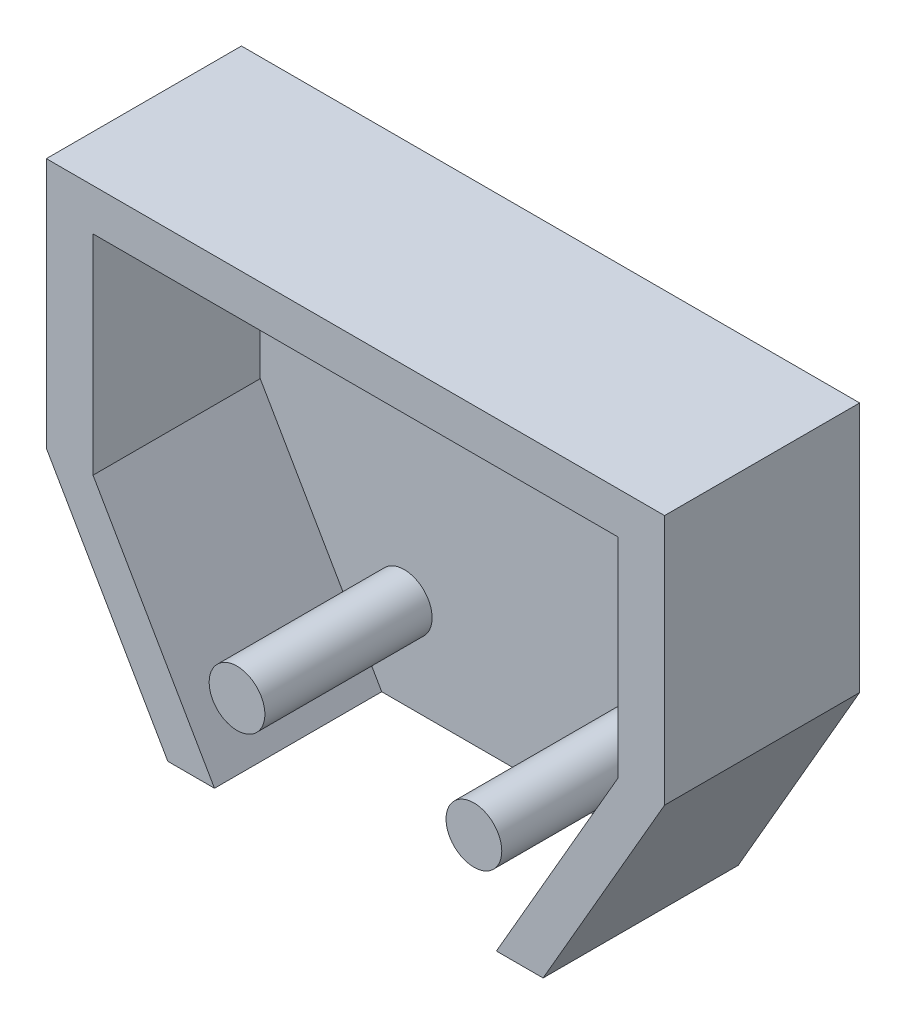
ISO-10303-21;
HEADER;
FILE_DESCRIPTION(('STEP AP214'),'2;1');
FILE_NAME('part.step','',(''),(''),'','','');
FILE_SCHEMA(('AUTOMOTIVE_DESIGN { 1 0 10303 214 1 1 1 1 }'));
ENDSEC;
DATA;
#1=APPLICATION_CONTEXT('core data for automotive mechanical design processes');
#2=APPLICATION_PROTOCOL_DEFINITION('international standard','automotive_design',2000,#1);
#3=PRODUCT_CONTEXT('',#1,'mechanical');
#4=PRODUCT('Part','Part','',(#3));
#5=PRODUCT_RELATED_PRODUCT_CATEGORY('part','',(#4));
#6=PRODUCT_DEFINITION_FORMATION('','',#4);
#7=PRODUCT_DEFINITION_CONTEXT('part definition',#1,'design');
#8=PRODUCT_DEFINITION('design','',#6,#7);
#9=PRODUCT_DEFINITION_SHAPE('','',#8);
#10=(LENGTH_UNIT() NAMED_UNIT(*) SI_UNIT(.MILLI.,.METRE.));
#11=(NAMED_UNIT(*) PLANE_ANGLE_UNIT() SI_UNIT($,.RADIAN.));
#12=(NAMED_UNIT(*) SI_UNIT($,.STERADIAN.) SOLID_ANGLE_UNIT());
#13=UNCERTAINTY_MEASURE_WITH_UNIT(LENGTH_MEASURE(1.E-05),#10,'distance_accuracy_value','');
#14=(GEOMETRIC_REPRESENTATION_CONTEXT(3) GLOBAL_UNCERTAINTY_ASSIGNED_CONTEXT((#13)) GLOBAL_UNIT_ASSIGNED_CONTEXT((#10,
#11,#12)) REPRESENTATION_CONTEXT('',''));
#15=CARTESIAN_POINT('',(0.,0.,0.));
#16=DIRECTION('',(0.,0.,1.));
#17=DIRECTION('',(1.,0.,0.));
#18=AXIS2_PLACEMENT_3D('',#15,#16,#17);
#19=CARTESIAN_POINT('',(0.,0.,2.));
#20=DIRECTION('',(0.,0.,-1.));
#21=DIRECTION('',(-1.,0.,0.));
#22=AXIS2_PLACEMENT_3D('',#19,#20,#21);
#23=PLANE('',#22);
#24=CARTESIAN_POINT('',(32.355,-11.594084101994,2.));
#25=DIRECTION('',(0.,0.,1.));
#26=DIRECTION('',(1.,0.,0.));
#27=AXIS2_PLACEMENT_3D('',#24,#25,#26);
#28=CIRCLE('',#27,2.00000000000001);
#29=CARTESIAN_POINT('',(34.355,-11.594084101994,2.));
#30=VERTEX_POINT('',#29);
#31=EDGE_CURVE('E264',#30,#30,#28,.F.);
#32=ORIENTED_EDGE('',*,*,#31,.T.);
#33=EDGE_LOOP('',(#32));
#34=FACE_BOUND('',#33,.T.);
#35=CARTESIAN_POINT('',(15.355,-11.594084101994,2.));
#36=DIRECTION('',(0.,0.,-1.));
#37=DIRECTION('',(-1.,0.,0.));
#38=AXIS2_PLACEMENT_3D('',#35,#36,#37);
#39=CIRCLE('',#38,2.);
#40=CARTESIAN_POINT('',(13.355,-11.594084101994,2.));
#41=VERTEX_POINT('',#40);
#42=EDGE_CURVE('E11',#41,#41,#39,.F.);
#43=ORIENTED_EDGE('',*,*,#42,.F.);
#44=EDGE_LOOP('',(#43));
#45=FACE_BOUND('',#44,.T.);
#46=DIRECTION('',(-0.499999999999998,-0.86602540378444,0.));
#47=VECTOR('',#46,1.);
#48=CARTESIAN_POINT('',(33.2703525403786,-19.2086469952212,2.));
#49=LINE('',#48,#47);
#50=CARTESIAN_POINT('',(42.6884591186013,-2.89600789064071,1.99999999999999));
#51=VERTEX_POINT('',#50);
#52=CARTESIAN_POINT('',(33.970470053838,-17.9960078906407,2.));
#53=VERTEX_POINT('',#52);
#54=EDGE_CURVE('E276',#51,#53,#49,.T.);
#55=ORIENTED_EDGE('',*,*,#54,.F.);
#56=DIRECTION('',(0.,-1.,0.));
#57=VECTOR('',#56,1.);
#58=CARTESIAN_POINT('',(42.6884591186013,12.1039921093593,1.99999999999999));
#59=LINE('',#58,#57);
#60=CARTESIAN_POINT('',(42.6884591186013,12.1039921093593,1.99999999999999));
#61=VERTEX_POINT('',#60);
#62=EDGE_CURVE('E258',#61,#51,#59,.T.);
#63=ORIENTED_EDGE('',*,*,#62,.F.);
#64=DIRECTION('',(1.,0.,0.));
#65=VECTOR('',#64,1.);
#66=CARTESIAN_POINT('',(42.6884591186013,12.1039921093593,1.99999999999999));
#67=LINE('',#66,#65);
#68=CARTESIAN_POINT('',(5.02154088139889,12.1039921093593,2.));
#69=VERTEX_POINT('',#68);
#70=EDGE_CURVE('E230',#69,#61,#67,.T.);
#71=ORIENTED_EDGE('',*,*,#70,.F.);
#72=DIRECTION('',(0.,-1.,0.));
#73=VECTOR('',#72,1.);
#74=CARTESIAN_POINT('',(5.02154088139889,12.1039921093593,2.));
#75=LINE('',#74,#73);
#76=CARTESIAN_POINT('',(5.0215408813989,-2.89600789064073,2.));
#77=VERTEX_POINT('',#76);
#78=EDGE_CURVE('E261',#69,#77,#75,.T.);
#79=ORIENTED_EDGE('',*,*,#78,.T.);
#80=DIRECTION('',(-0.499999999999998,0.86602540378444,0.));
#81=VECTOR('',#80,1.);
#82=CARTESIAN_POINT('',(2.51214745962165,1.45038901205659,2.));
#83=LINE('',#82,#81);
#84=CARTESIAN_POINT('',(13.7395299461622,-17.9960078906407,2.));
#85=VERTEX_POINT('',#84);
#86=EDGE_CURVE('E301',#85,#77,#83,.T.);
#87=ORIENTED_EDGE('',*,*,#86,.F.);
#88=DIRECTION('',(1.,0.,0.));
#89=VECTOR('',#88,1.);
#90=CARTESIAN_POINT('',(37.3200000000002,-17.9960078906407,2.));
#91=LINE('',#90,#89);
#92=EDGE_CURVE('E65',#85,#53,#91,.T.);
#93=ORIENTED_EDGE('',*,*,#92,.T.);
#94=EDGE_LOOP('',(#55,#63,#71,#79,#87,#93));
#95=FACE_BOUND('',#94,.T.);
#96=ADVANCED_FACE('F41',(#34,#45,#95),#23,.F.);
#97=CARTESIAN_POINT('',(10.3899999999998,-17.9960078906407,2.));
#98=DIRECTION('',(0.866025403784443,0.499999999999992,0.));
#99=DIRECTION('',(-0.499999999999992,0.866025403784443,0.));
#100=AXIS2_PLACEMENT_3D('',#97,#98,#99);
#101=PLANE('',#100);
#102=DIRECTION('',(0.,0.,-1.));
#103=VECTOR('',#102,1.);
#104=CARTESIAN_POINT('',(1.67201093523667,-2.89600789064074,14.));
#105=LINE('',#104,#103);
#106=CARTESIAN_POINT('',(1.67201093523667,-2.89600789064074,14.));
#107=VERTEX_POINT('',#106);
#108=CARTESIAN_POINT('',(1.67201093523667,-2.89600789064074,0.));
#109=VERTEX_POINT('',#108);
#110=EDGE_CURVE('E320',#107,#109,#105,.T.);
#111=ORIENTED_EDGE('',*,*,#110,.T.);
#112=DIRECTION('',(0.499999999999992,-0.866025403784443,0.));
#113=VECTOR('',#112,1.);
#114=CARTESIAN_POINT('',(10.3899999999998,-17.9960078906407,0.));
#115=LINE('',#114,#113);
#116=CARTESIAN_POINT('',(10.3899999999998,-17.9960078906407,0.));
#117=VERTEX_POINT('',#116);
#118=EDGE_CURVE('E328',#109,#117,#115,.T.);
#119=ORIENTED_EDGE('',*,*,#118,.T.);
#120=DIRECTION('',(0.,0.,-1.));
#121=VECTOR('',#120,1.);
#122=CARTESIAN_POINT('',(10.3899999999998,-17.9960078906407,2.));
#123=LINE('',#122,#121);
#124=CARTESIAN_POINT('',(10.3899999999998,-17.9960078906407,14.));
#125=VERTEX_POINT('',#124);
#126=EDGE_CURVE('E50',#125,#117,#123,.T.);
#127=ORIENTED_EDGE('',*,*,#126,.F.);
#128=DIRECTION('',(0.499999999999992,-0.866025403784443,0.));
#129=VECTOR('',#128,1.);
#130=CARTESIAN_POINT('',(0.,0.,14.));
#131=LINE('',#130,#129);
#132=EDGE_CURVE('E306',#107,#125,#131,.T.);
#133=ORIENTED_EDGE('',*,*,#132,.F.);
#134=EDGE_LOOP('',(#111,#119,#127,#133));
#135=FACE_BOUND('',#134,.T.);
#136=ADVANCED_FACE('F43',(#135),#101,.F.);
#137=CARTESIAN_POINT('',(37.3200000000002,-17.9960078906407,2.));
#138=DIRECTION('',(0.,1.,0.));
#139=DIRECTION('',(-1.,0.,0.));
#140=AXIS2_PLACEMENT_3D('',#137,#138,#139);
#141=PLANE('',#140);
#142=DIRECTION('',(1.,0.,0.));
#143=VECTOR('',#142,1.);
#144=CARTESIAN_POINT('',(37.3200000000002,-17.9960078906407,0.));
#145=LINE('',#144,#143);
#146=CARTESIAN_POINT('',(37.3200000000002,-17.9960078906407,0.));
#147=VERTEX_POINT('',#146);
#148=EDGE_CURVE('E335',#117,#147,#145,.T.);
#149=ORIENTED_EDGE('',*,*,#148,.T.);
#150=DIRECTION('',(0.,0.,-1.));
#151=VECTOR('',#150,1.);
#152=CARTESIAN_POINT('',(37.3200000000002,-17.9960078906407,2.));
#153=LINE('',#152,#151);
#154=CARTESIAN_POINT('',(37.3200000000002,-17.9960078906407,14.));
#155=VERTEX_POINT('',#154);
#156=EDGE_CURVE('E331',#155,#147,#153,.T.);
#157=ORIENTED_EDGE('',*,*,#156,.F.);
#158=DIRECTION('',(1.,0.,0.));
#159=VECTOR('',#158,1.);
#160=CARTESIAN_POINT('',(0.,-17.9960078906407,14.));
#161=LINE('',#160,#159);
#162=CARTESIAN_POINT('',(33.970470053838,-17.9960078906407,14.));
#163=VERTEX_POINT('',#162);
#164=EDGE_CURVE('E280',#163,#155,#161,.T.);
#165=ORIENTED_EDGE('',*,*,#164,.F.);
#166=DIRECTION('',(0.,0.,-1.));
#167=VECTOR('',#166,1.);
#168=CARTESIAN_POINT('',(33.970470053838,-17.9960078906407,14.));
#169=LINE('',#168,#167);
#170=EDGE_CURVE('E293',#163,#53,#169,.T.);
#171=ORIENTED_EDGE('',*,*,#170,.T.);
#172=ORIENTED_EDGE('',*,*,#92,.F.);
#173=DIRECTION('',(0.,0.,-1.));
#174=VECTOR('',#173,1.);
#175=CARTESIAN_POINT('',(13.7395299461622,-17.9960078906407,14.));
#176=LINE('',#175,#174);
#177=CARTESIAN_POINT('',(13.7395299461622,-17.9960078906407,14.));
#178=VERTEX_POINT('',#177);
#179=EDGE_CURVE('E313',#178,#85,#176,.T.);
#180=ORIENTED_EDGE('',*,*,#179,.F.);
#181=DIRECTION('',(1.,0.,0.));
#182=VECTOR('',#181,1.);
#183=CARTESIAN_POINT('',(0.,-17.9960078906407,14.));
#184=LINE('',#183,#182);
#185=EDGE_CURVE('E310',#125,#178,#184,.T.);
#186=ORIENTED_EDGE('',*,*,#185,.F.);
#187=ORIENTED_EDGE('',*,*,#126,.T.);
#188=EDGE_LOOP('',(#149,#157,#165,#171,#172,#180,#186,#187));
#189=FACE_BOUND('',#188,.T.);
#190=ADVANCED_FACE('F347',(#189),#141,.F.);
#191=CARTESIAN_POINT('',(47.71,0.,2.));
#192=DIRECTION('',(-0.866025403784443,0.499999999999992,0.));
#193=DIRECTION('',(-0.499999999999992,-0.866025403784443,0.));
#194=AXIS2_PLACEMENT_3D('',#191,#192,#193);
#195=PLANE('',#194);
#196=DIRECTION('',(0.499999999999992,0.866025403784443,0.));
#197=VECTOR('',#196,1.);
#198=CARTESIAN_POINT('',(47.71,0.,0.));
#199=LINE('',#198,#197);
#200=CARTESIAN_POINT('',(46.0379890647633,-2.89600789064071,0.));
#201=VERTEX_POINT('',#200);
#202=EDGE_CURVE('E332',#147,#201,#199,.T.);
#203=ORIENTED_EDGE('',*,*,#202,.T.);
#204=DIRECTION('',(0.,0.,-1.));
#205=VECTOR('',#204,1.);
#206=CARTESIAN_POINT('',(46.0379890647633,-2.89600789064074,14.));
#207=LINE('',#206,#205);
#208=CARTESIAN_POINT('',(46.0379890647633,-2.89600789064071,14.));
#209=VERTEX_POINT('',#208);
#210=EDGE_CURVE('E288',#209,#201,#207,.T.);
#211=ORIENTED_EDGE('',*,*,#210,.F.);
#212=DIRECTION('',(0.499999999999992,0.866025403784443,0.));
#213=VECTOR('',#212,1.);
#214=CARTESIAN_POINT('',(35.7825000000004,-20.6590360072776,14.));
#215=LINE('',#214,#213);
#216=EDGE_CURVE('E284',#155,#209,#215,.T.);
#217=ORIENTED_EDGE('',*,*,#216,.F.);
#218=ORIENTED_EDGE('',*,*,#156,.T.);
#219=EDGE_LOOP('',(#203,#211,#217,#218));
#220=FACE_BOUND('',#219,.T.);
#221=ADVANCED_FACE('F366',(#220),#195,.F.);
#222=CARTESIAN_POINT('',(0.,0.,0.));
#223=DIRECTION('',(0.,0.,-1.));
#224=DIRECTION('',(-1.,0.,0.));
#225=AXIS2_PLACEMENT_3D('',#222,#223,#224);
#226=PLANE('',#225);
#227=ORIENTED_EDGE('',*,*,#118,.F.);
#228=DIRECTION('',(0.,-1.,0.));
#229=VECTOR('',#228,1.);
#230=CARTESIAN_POINT('',(1.67201093523666,12.1039921093593,0.));
#231=LINE('',#230,#229);
#232=CARTESIAN_POINT('',(1.67201093523666,15.1039921093593,0.));
#233=VERTEX_POINT('',#232);
#234=EDGE_CURVE('E244',#233,#109,#231,.T.);
#235=ORIENTED_EDGE('',*,*,#234,.F.);
#236=DIRECTION('',(-1.,0.,0.));
#237=VECTOR('',#236,1.);
#238=CARTESIAN_POINT('',(1.67201093523666,15.1039921093593,0.));
#239=LINE('',#238,#237);
#240=CARTESIAN_POINT('',(46.0379890647633,15.1039921093593,0.));
#241=VERTEX_POINT('',#240);
#242=EDGE_CURVE('E219',#241,#233,#239,.T.);
#243=ORIENTED_EDGE('',*,*,#242,.F.);
#244=DIRECTION('',(0.,-1.,0.));
#245=VECTOR('',#244,1.);
#246=CARTESIAN_POINT('',(46.0379890647633,12.1039921093593,0.));
#247=LINE('',#246,#245);
#248=EDGE_CURVE('E247',#241,#201,#247,.T.);
#249=ORIENTED_EDGE('',*,*,#248,.T.);
#250=ORIENTED_EDGE('',*,*,#202,.F.);
#251=ORIENTED_EDGE('',*,*,#148,.F.);
#252=EDGE_LOOP('',(#227,#235,#243,#249,#250,#251));
#253=FACE_BOUND('',#252,.T.);
#254=ADVANCED_FACE('F361',(#253),#226,.T.);
#255=CARTESIAN_POINT('',(2.51214745962165,1.45038901205659,14.));
#256=DIRECTION('',(-0.86602540378444,-0.499999999999998,0.));
#257=DIRECTION('',(0.499999999999998,-0.86602540378444,0.));
#258=AXIS2_PLACEMENT_3D('',#255,#256,#257);
#259=PLANE('',#258);
#260=ORIENTED_EDGE('',*,*,#86,.T.);
#261=DIRECTION('',(0.,0.,-1.));
#262=VECTOR('',#261,1.);
#263=CARTESIAN_POINT('',(5.02154088139889,-2.89600789064074,14.));
#264=LINE('',#263,#262);
#265=CARTESIAN_POINT('',(5.02154088139889,-2.89600789064073,14.));
#266=VERTEX_POINT('',#265);
#267=EDGE_CURVE('E324',#266,#77,#264,.T.);
#268=ORIENTED_EDGE('',*,*,#267,.F.);
#269=DIRECTION('',(-0.499999999999998,0.86602540378444,0.));
#270=VECTOR('',#269,1.);
#271=CARTESIAN_POINT('',(2.51214745962165,1.45038901205659,14.));
#272=LINE('',#271,#270);
#273=EDGE_CURVE('E302',#178,#266,#272,.T.);
#274=ORIENTED_EDGE('',*,*,#273,.F.);
#275=ORIENTED_EDGE('',*,*,#179,.T.);
#276=EDGE_LOOP('',(#260,#268,#274,#275));
#277=FACE_BOUND('',#276,.T.);
#278=ADVANCED_FACE('F375',(#277),#259,.F.);
#279=CARTESIAN_POINT('',(0.,0.,14.));
#280=DIRECTION('',(0.,0.,1.));
#281=DIRECTION('',(1.,0.,0.));
#282=AXIS2_PLACEMENT_3D('',#279,#280,#281);
#283=PLANE('',#282);
#284=ORIENTED_EDGE('',*,*,#273,.T.);
#285=DIRECTION('',(0.,-1.,0.));
#286=VECTOR('',#285,1.);
#287=CARTESIAN_POINT('',(5.02154088139888,12.1039921093593,14.));
#288=LINE('',#287,#286);
#289=CARTESIAN_POINT('',(5.02154088139888,12.1039921093593,14.));
#290=VERTEX_POINT('',#289);
#291=EDGE_CURVE('E238',#290,#266,#288,.T.);
#292=ORIENTED_EDGE('',*,*,#291,.F.);
#293=DIRECTION('',(1.,0.,0.));
#294=VECTOR('',#293,1.);
#295=CARTESIAN_POINT('',(1.67201093523666,12.1039921093593,14.));
#296=LINE('',#295,#294);
#297=CARTESIAN_POINT('',(42.6884591186013,12.1039921093593,14.));
#298=VERTEX_POINT('',#297);
#299=EDGE_CURVE('E201',#290,#298,#296,.T.);
#300=ORIENTED_EDGE('',*,*,#299,.T.);
#301=DIRECTION('',(0.,-1.,0.));
#302=VECTOR('',#301,1.);
#303=CARTESIAN_POINT('',(42.6884591186013,12.1039921093593,14.));
#304=LINE('',#303,#302);
#305=CARTESIAN_POINT('',(42.6884591186013,-2.89600789064071,14.));
#306=VERTEX_POINT('',#305);
#307=EDGE_CURVE('E254',#298,#306,#304,.T.);
#308=ORIENTED_EDGE('',*,*,#307,.T.);
#309=DIRECTION('',(-0.499999999999998,-0.86602540378444,0.));
#310=VECTOR('',#309,1.);
#311=CARTESIAN_POINT('',(33.2703525403786,-19.2086469952212,14.));
#312=LINE('',#311,#310);
#313=EDGE_CURVE('E277',#306,#163,#312,.T.);
#314=ORIENTED_EDGE('',*,*,#313,.T.);
#315=ORIENTED_EDGE('',*,*,#164,.T.);
#316=ORIENTED_EDGE('',*,*,#216,.T.);
#317=DIRECTION('',(0.,-1.,0.));
#318=VECTOR('',#317,1.);
#319=CARTESIAN_POINT('',(46.0379890647633,12.1039921093593,14.));
#320=LINE('',#319,#318);
#321=CARTESIAN_POINT('',(46.0379890647633,15.1039921093593,14.));
#322=VERTEX_POINT('',#321);
#323=EDGE_CURVE('E251',#322,#209,#320,.T.);
#324=ORIENTED_EDGE('',*,*,#323,.F.);
#325=DIRECTION('',(1.,0.,0.));
#326=VECTOR('',#325,1.);
#327=CARTESIAN_POINT('',(1.67201093523666,15.1039921093593,14.));
#328=LINE('',#327,#326);
#329=CARTESIAN_POINT('',(1.67201093523666,15.1039921093593,14.));
#330=VERTEX_POINT('',#329);
#331=EDGE_CURVE('E211',#330,#322,#328,.T.);
#332=ORIENTED_EDGE('',*,*,#331,.F.);
#333=DIRECTION('',(0.,-1.,0.));
#334=VECTOR('',#333,1.);
#335=CARTESIAN_POINT('',(1.67201093523666,12.1039921093593,14.));
#336=LINE('',#335,#334);
#337=EDGE_CURVE('E241',#330,#107,#336,.T.);
#338=ORIENTED_EDGE('',*,*,#337,.T.);
#339=ORIENTED_EDGE('',*,*,#132,.T.);
#340=ORIENTED_EDGE('',*,*,#185,.T.);
#341=EDGE_LOOP('',(#284,#292,#300,#308,#314,#315,#316,#324,#332,#338,#339,#340));
#342=FACE_BOUND('',#341,.T.);
#343=ADVANCED_FACE('F354',(#342),#283,.T.);
#344=CARTESIAN_POINT('',(33.2703525403786,-19.2086469952212,14.));
#345=DIRECTION('',(0.86602540378444,-0.499999999999998,0.));
#346=DIRECTION('',(0.499999999999998,0.86602540378444,0.));
#347=AXIS2_PLACEMENT_3D('',#344,#345,#346);
#348=PLANE('',#347);
#349=ORIENTED_EDGE('',*,*,#54,.T.);
#350=ORIENTED_EDGE('',*,*,#170,.F.);
#351=ORIENTED_EDGE('',*,*,#313,.F.);
#352=DIRECTION('',(0.,0.,-1.));
#353=VECTOR('',#352,1.);
#354=CARTESIAN_POINT('',(42.6884591186013,-2.89600789064074,14.));
#355=LINE('',#354,#353);
#356=EDGE_CURVE('E297',#306,#51,#355,.T.);
#357=ORIENTED_EDGE('',*,*,#356,.T.);
#358=EDGE_LOOP('',(#349,#350,#351,#357));
#359=FACE_BOUND('',#358,.T.);
#360=ADVANCED_FACE('F372',(#359),#348,.F.);
#361=CARTESIAN_POINT('',(15.355,-11.594084101994,14.));
#362=DIRECTION('',(0.,0.,-1.));
#363=DIRECTION('',(-1.,0.,0.));
#364=AXIS2_PLACEMENT_3D('',#361,#362,#363);
#365=CYLINDRICAL_SURFACE('',#364,2.);
#366=CARTESIAN_POINT('',(15.355,-11.594084101994,14.));
#367=DIRECTION('',(0.,0.,1.));
#368=DIRECTION('',(1.,0.,0.));
#369=AXIS2_PLACEMENT_3D('',#366,#367,#368);
#370=CIRCLE('',#369,2.);
#371=CARTESIAN_POINT('',(17.355,-11.594084101994,14.));
#372=VERTEX_POINT('',#371);
#373=EDGE_CURVE('E269',#372,#372,#370,.T.);
#374=ORIENTED_EDGE('',*,*,#373,.F.);
#375=EDGE_LOOP('',(#374));
#376=FACE_BOUND('',#375,.T.);
#377=ORIENTED_EDGE('',*,*,#42,.T.);
#378=EDGE_LOOP('',(#377));
#379=FACE_BOUND('',#378,.T.);
#380=ADVANCED_FACE('F431',(#376,#379),#365,.T.);
#381=CARTESIAN_POINT('',(0.,0.,14.));
#382=DIRECTION('',(0.,0.,1.));
#383=DIRECTION('',(1.,0.,0.));
#384=AXIS2_PLACEMENT_3D('',#381,#382,#383);
#385=PLANE('',#384);
#386=ORIENTED_EDGE('',*,*,#373,.T.);
#387=EDGE_LOOP('',(#386));
#388=FACE_BOUND('',#387,.T.);
#389=ADVANCED_FACE('F437',(#388),#385,.T.);
#390=CARTESIAN_POINT('',(32.355,-11.594084101994,14.));
#391=DIRECTION('',(0.,0.,-1.));
#392=DIRECTION('',(-1.,0.,0.));
#393=AXIS2_PLACEMENT_3D('',#390,#391,#392);
#394=CYLINDRICAL_SURFACE('',#393,2.00000000000001);
#395=CARTESIAN_POINT('',(32.355,-11.594084101994,14.));
#396=DIRECTION('',(0.,0.,1.));
#397=DIRECTION('',(1.,0.,0.));
#398=AXIS2_PLACEMENT_3D('',#395,#396,#397);
#399=CIRCLE('',#398,2.00000000000001);
#400=CARTESIAN_POINT('',(34.355,-11.594084101994,14.));
#401=VERTEX_POINT('',#400);
#402=EDGE_CURVE('E265',#401,#401,#399,.F.);
#403=ORIENTED_EDGE('',*,*,#402,.T.);
#404=EDGE_LOOP('',(#403));
#405=FACE_BOUND('',#404,.T.);
#406=ORIENTED_EDGE('',*,*,#31,.F.);
#407=EDGE_LOOP('',(#406));
#408=FACE_BOUND('',#407,.T.);
#409=ADVANCED_FACE('F445',(#405,#408),#394,.T.);
#410=CARTESIAN_POINT('',(0.,0.,14.));
#411=DIRECTION('',(0.,0.,1.));
#412=DIRECTION('',(1.,0.,0.));
#413=AXIS2_PLACEMENT_3D('',#410,#411,#412);
#414=PLANE('',#413);
#415=ORIENTED_EDGE('',*,*,#402,.F.);
#416=EDGE_LOOP('',(#415));
#417=FACE_BOUND('',#416,.T.);
#418=ADVANCED_FACE('F453',(#417),#414,.T.);
#419=CARTESIAN_POINT('',(5.02154088139889,12.1039921093593,2.));
#420=DIRECTION('',(-1.,0.,0.));
#421=DIRECTION('',(0.,-1.,0.));
#422=AXIS2_PLACEMENT_3D('',#419,#420,#421);
#423=PLANE('',#422);
#424=ORIENTED_EDGE('',*,*,#267,.T.);
#425=ORIENTED_EDGE('',*,*,#78,.F.);
#426=DIRECTION('',(0.,0.,-1.));
#427=VECTOR('',#426,1.);
#428=CARTESIAN_POINT('',(5.02154088139889,12.1039921093593,2.));
#429=LINE('',#428,#427);
#430=EDGE_CURVE('E223',#290,#69,#429,.T.);
#431=ORIENTED_EDGE('',*,*,#430,.F.);
#432=ORIENTED_EDGE('',*,*,#291,.T.);
#433=EDGE_LOOP('',(#424,#425,#431,#432));
#434=FACE_BOUND('',#433,.T.);
#435=ADVANCED_FACE('F381',(#434),#423,.F.);
#436=CARTESIAN_POINT('',(42.6884591186013,12.1039921093593,14.));
#437=DIRECTION('',(1.,0.,0.));
#438=DIRECTION('',(0.,1.,0.));
#439=AXIS2_PLACEMENT_3D('',#436,#437,#438);
#440=PLANE('',#439);
#441=ORIENTED_EDGE('',*,*,#356,.F.);
#442=ORIENTED_EDGE('',*,*,#307,.F.);
#443=DIRECTION('',(0.,0.,1.));
#444=VECTOR('',#443,1.);
#445=CARTESIAN_POINT('',(42.6884591186013,12.1039921093593,14.));
#446=LINE('',#445,#444);
#447=EDGE_CURVE('E234',#61,#298,#446,.T.);
#448=ORIENTED_EDGE('',*,*,#447,.F.);
#449=ORIENTED_EDGE('',*,*,#62,.T.);
#450=EDGE_LOOP('',(#441,#442,#448,#449));
#451=FACE_BOUND('',#450,.T.);
#452=ADVANCED_FACE('F386',(#451),#440,.F.);
#453=CARTESIAN_POINT('',(46.0379890647633,12.1039921093593,0.));
#454=DIRECTION('',(-1.,0.,0.));
#455=DIRECTION('',(0.,-1.,0.));
#456=AXIS2_PLACEMENT_3D('',#453,#454,#455);
#457=PLANE('',#456);
#458=ORIENTED_EDGE('',*,*,#210,.T.);
#459=ORIENTED_EDGE('',*,*,#248,.F.);
#460=DIRECTION('',(0.,0.,-1.));
#461=VECTOR('',#460,1.);
#462=CARTESIAN_POINT('',(46.0379890647633,15.1039921093593,14.));
#463=LINE('',#462,#461);
#464=EDGE_CURVE('E215',#322,#241,#463,.T.);
#465=ORIENTED_EDGE('',*,*,#464,.F.);
#466=ORIENTED_EDGE('',*,*,#323,.T.);
#467=EDGE_LOOP('',(#458,#459,#465,#466));
#468=FACE_BOUND('',#467,.T.);
#469=ADVANCED_FACE('F473',(#468),#457,.F.);
#470=CARTESIAN_POINT('',(1.67201093523666,12.1039921093593,14.));
#471=DIRECTION('',(1.,0.,0.));
#472=DIRECTION('',(0.,1.,0.));
#473=AXIS2_PLACEMENT_3D('',#470,#471,#472);
#474=PLANE('',#473);
#475=ORIENTED_EDGE('',*,*,#110,.F.);
#476=ORIENTED_EDGE('',*,*,#337,.F.);
#477=DIRECTION('',(0.,0.,1.));
#478=VECTOR('',#477,1.);
#479=CARTESIAN_POINT('',(1.67201093523666,15.1039921093593,14.));
#480=LINE('',#479,#478);
#481=EDGE_CURVE('E207',#233,#330,#480,.T.);
#482=ORIENTED_EDGE('',*,*,#481,.F.);
#483=ORIENTED_EDGE('',*,*,#234,.T.);
#484=EDGE_LOOP('',(#475,#476,#482,#483));
#485=FACE_BOUND('',#484,.T.);
#486=ADVANCED_FACE('F359',(#485),#474,.F.);
#487=CARTESIAN_POINT('',(0.,15.1039921093593,0.));
#488=DIRECTION('',(0.,-1.,0.));
#489=DIRECTION('',(1.,0.,0.));
#490=AXIS2_PLACEMENT_3D('',#487,#488,#489);
#491=PLANE('',#490);
#492=ORIENTED_EDGE('',*,*,#481,.T.);
#493=ORIENTED_EDGE('',*,*,#331,.T.);
#494=ORIENTED_EDGE('',*,*,#464,.T.);
#495=ORIENTED_EDGE('',*,*,#242,.T.);
#496=EDGE_LOOP('',(#492,#493,#494,#495));
#497=FACE_BOUND('',#496,.T.);
#498=ADVANCED_FACE('F487',(#497),#491,.F.);
#499=CARTESIAN_POINT('',(0.,12.1039921093593,0.));
#500=DIRECTION('',(0.,-1.,0.));
#501=DIRECTION('',(1.,0.,0.));
#502=AXIS2_PLACEMENT_3D('',#499,#500,#501);
#503=PLANE('',#502);
#504=DIRECTION('',(1.,0.,0.));
#505=VECTOR('',#504,1.);
#506=CARTESIAN_POINT('',(0.,12.1039921093593,3.));
#507=LINE('',#506,#505);
#508=CARTESIAN_POINT('',(5.19500000000012,12.1039921093593,3.));
#509=VERTEX_POINT('',#508);
#510=CARTESIAN_POINT('',(42.5150000000001,12.1039921093593,3.));
#511=VERTEX_POINT('',#510);
#512=EDGE_CURVE('E57',#509,#511,#507,.T.);
#513=ORIENTED_EDGE('',*,*,#512,.F.);
#514=DIRECTION('',(0.,0.,-1.));
#515=VECTOR('',#514,1.);
#516=CARTESIAN_POINT('',(5.19500000000012,12.1039921093593,0.));
#517=LINE('',#516,#515);
#518=CARTESIAN_POINT('',(5.19500000000012,12.1039921093593,13.));
#519=VERTEX_POINT('',#518);
#520=EDGE_CURVE('E179',#519,#509,#517,.T.);
#521=ORIENTED_EDGE('',*,*,#520,.F.);
#522=DIRECTION('',(1.,0.,0.));
#523=VECTOR('',#522,1.);
#524=CARTESIAN_POINT('',(0.,12.1039921093593,13.));
#525=LINE('',#524,#523);
#526=CARTESIAN_POINT('',(42.5150000000001,12.1039921093593,13.));
#527=VERTEX_POINT('',#526);
#528=EDGE_CURVE('E183',#519,#527,#525,.T.);
#529=ORIENTED_EDGE('',*,*,#528,.T.);
#530=DIRECTION('',(0.,0.,-1.));
#531=VECTOR('',#530,1.);
#532=CARTESIAN_POINT('',(42.5150000000001,12.1039921093593,0.));
#533=LINE('',#532,#531);
#534=EDGE_CURVE('E192',#527,#511,#533,.T.);
#535=ORIENTED_EDGE('',*,*,#534,.T.);
#536=EDGE_LOOP('',(#513,#521,#529,#535));
#537=FACE_BOUND('',#536,.T.);
#538=ORIENTED_EDGE('',*,*,#299,.F.);
#539=ORIENTED_EDGE('',*,*,#430,.T.);
#540=ORIENTED_EDGE('',*,*,#70,.T.);
#541=ORIENTED_EDGE('',*,*,#447,.T.);
#542=EDGE_LOOP('',(#538,#539,#540,#541));
#543=FACE_BOUND('',#542,.T.);
#544=ADVANCED_FACE('F383',(#537,#543),#503,.T.);
#545=CARTESIAN_POINT('',(0.,13.1039921093593,3.));
#546=DIRECTION('',(0.,0.,-1.));
#547=DIRECTION('',(-1.,0.,0.));
#548=AXIS2_PLACEMENT_3D('',#545,#546,#547);
#549=PLANE('',#548);
#550=ORIENTED_EDGE('',*,*,#512,.T.);
#551=DIRECTION('',(0.,-1.,0.));
#552=VECTOR('',#551,1.);
#553=CARTESIAN_POINT('',(42.5150000000001,13.1039921093593,3.));
#554=LINE('',#553,#552);
#555=CARTESIAN_POINT('',(42.5150000000001,13.1039921093593,3.));
#556=VERTEX_POINT('',#555);
#557=EDGE_CURVE('E160',#556,#511,#554,.T.);
#558=ORIENTED_EDGE('',*,*,#557,.F.);
#559=DIRECTION('',(1.,0.,0.));
#560=VECTOR('',#559,1.);
#561=CARTESIAN_POINT('',(0.,13.1039921093593,3.));
#562=LINE('',#561,#560);
#563=CARTESIAN_POINT('',(5.19500000000012,13.1039921093593,3.));
#564=VERTEX_POINT('',#563);
#565=EDGE_CURVE('E168',#564,#556,#562,.T.);
#566=ORIENTED_EDGE('',*,*,#565,.F.);
#567=DIRECTION('',(0.,-1.,0.));
#568=VECTOR('',#567,1.);
#569=CARTESIAN_POINT('',(5.19500000000012,13.1039921093593,3.));
#570=LINE('',#569,#568);
#571=EDGE_CURVE('E198',#564,#509,#570,.T.);
#572=ORIENTED_EDGE('',*,*,#571,.T.);
#573=EDGE_LOOP('',(#550,#558,#566,#572));
#574=FACE_BOUND('',#573,.T.);
#575=ADVANCED_FACE('F171',(#574),#549,.F.);
#576=CARTESIAN_POINT('',(5.19500000000012,13.1039921093593,0.));
#577=DIRECTION('',(-1.,0.,0.));
#578=DIRECTION('',(0.,-1.,0.));
#579=AXIS2_PLACEMENT_3D('',#576,#577,#578);
#580=PLANE('',#579);
#581=ORIENTED_EDGE('',*,*,#520,.T.);
#582=ORIENTED_EDGE('',*,*,#571,.F.);
#583=DIRECTION('',(0.,0.,-1.));
#584=VECTOR('',#583,1.);
#585=CARTESIAN_POINT('',(5.19500000000012,13.1039921093593,0.));
#586=LINE('',#585,#584);
#587=CARTESIAN_POINT('',(5.19500000000012,13.1039921093593,13.));
#588=VERTEX_POINT('',#587);
#589=EDGE_CURVE('E174',#588,#564,#586,.T.);
#590=ORIENTED_EDGE('',*,*,#589,.F.);
#591=DIRECTION('',(0.,-1.,0.));
#592=VECTOR('',#591,1.);
#593=CARTESIAN_POINT('',(5.19500000000012,13.1039921093593,13.));
#594=LINE('',#593,#592);
#595=EDGE_CURVE('E202',#588,#519,#594,.T.);
#596=ORIENTED_EDGE('',*,*,#595,.T.);
#597=EDGE_LOOP('',(#581,#582,#590,#596));
#598=FACE_BOUND('',#597,.T.);
#599=ADVANCED_FACE('F508',(#598),#580,.F.);
#600=CARTESIAN_POINT('',(0.,13.1039921093593,13.));
#601=DIRECTION('',(0.,0.,-1.));
#602=DIRECTION('',(-1.,0.,0.));
#603=AXIS2_PLACEMENT_3D('',#600,#601,#602);
#604=PLANE('',#603);
#605=ORIENTED_EDGE('',*,*,#528,.F.);
#606=ORIENTED_EDGE('',*,*,#595,.F.);
#607=DIRECTION('',(1.,0.,0.));
#608=VECTOR('',#607,1.);
#609=CARTESIAN_POINT('',(0.,13.1039921093593,13.));
#610=LINE('',#609,#608);
#611=CARTESIAN_POINT('',(42.5150000000001,13.1039921093593,13.));
#612=VERTEX_POINT('',#611);
#613=EDGE_CURVE('E167',#588,#612,#610,.T.);
#614=ORIENTED_EDGE('',*,*,#613,.T.);
#615=DIRECTION('',(0.,-1.,0.));
#616=VECTOR('',#615,1.);
#617=CARTESIAN_POINT('',(42.5150000000001,13.1039921093593,13.));
#618=LINE('',#617,#616);
#619=EDGE_CURVE('E162',#612,#527,#618,.T.);
#620=ORIENTED_EDGE('',*,*,#619,.T.);
#621=EDGE_LOOP('',(#605,#606,#614,#620));
#622=FACE_BOUND('',#621,.T.);
#623=ADVANCED_FACE('F515',(#622),#604,.T.);
#624=CARTESIAN_POINT('',(42.5150000000001,13.1039921093593,0.));
#625=DIRECTION('',(-1.,0.,0.));
#626=DIRECTION('',(0.,0.,1.));
#627=AXIS2_PLACEMENT_3D('',#624,#625,#626);
#628=PLANE('',#627);
#629=ORIENTED_EDGE('',*,*,#534,.F.);
#630=ORIENTED_EDGE('',*,*,#619,.F.);
#631=DIRECTION('',(0.,0.,-1.));
#632=VECTOR('',#631,1.);
#633=CARTESIAN_POINT('',(42.5150000000001,13.1039921093593,0.));
#634=LINE('',#633,#632);
#635=EDGE_CURVE('E157',#612,#556,#634,.T.);
#636=ORIENTED_EDGE('',*,*,#635,.T.);
#637=ORIENTED_EDGE('',*,*,#557,.T.);
#638=EDGE_LOOP('',(#629,#630,#636,#637));
#639=FACE_BOUND('',#638,.T.);
#640=ADVANCED_FACE('F159',(#639),#628,.T.);
#641=CARTESIAN_POINT('',(0.,13.1039921093593,0.));
#642=DIRECTION('',(0.,-1.,0.));
#643=DIRECTION('',(1.,0.,0.));
#644=AXIS2_PLACEMENT_3D('',#641,#642,#643);
#645=PLANE('',#644);
#646=ORIENTED_EDGE('',*,*,#565,.T.);
#647=ORIENTED_EDGE('',*,*,#635,.F.);
#648=ORIENTED_EDGE('',*,*,#613,.F.);
#649=ORIENTED_EDGE('',*,*,#589,.T.);
#650=EDGE_LOOP('',(#646,#647,#648,#649));
#651=FACE_BOUND('',#650,.T.);
#652=ADVANCED_FACE('F176',(#651),#645,.T.);
#653=CLOSED_SHELL('',(#96,#136,#190,#221,#254,#278,#343,#360,#380,#389,#409,#418,#435,#452,#469,
#486,#498,#544,#575,#599,#623,#640,#652));
#654=MANIFOLD_SOLID_BREP('B2',#653);
#655=ADVANCED_BREP_SHAPE_REPRESENTATION('',(#18,#654),#14);
#656=SHAPE_DEFINITION_REPRESENTATION(#9,#655);
ENDSEC;
END-ISO-10303-21;
